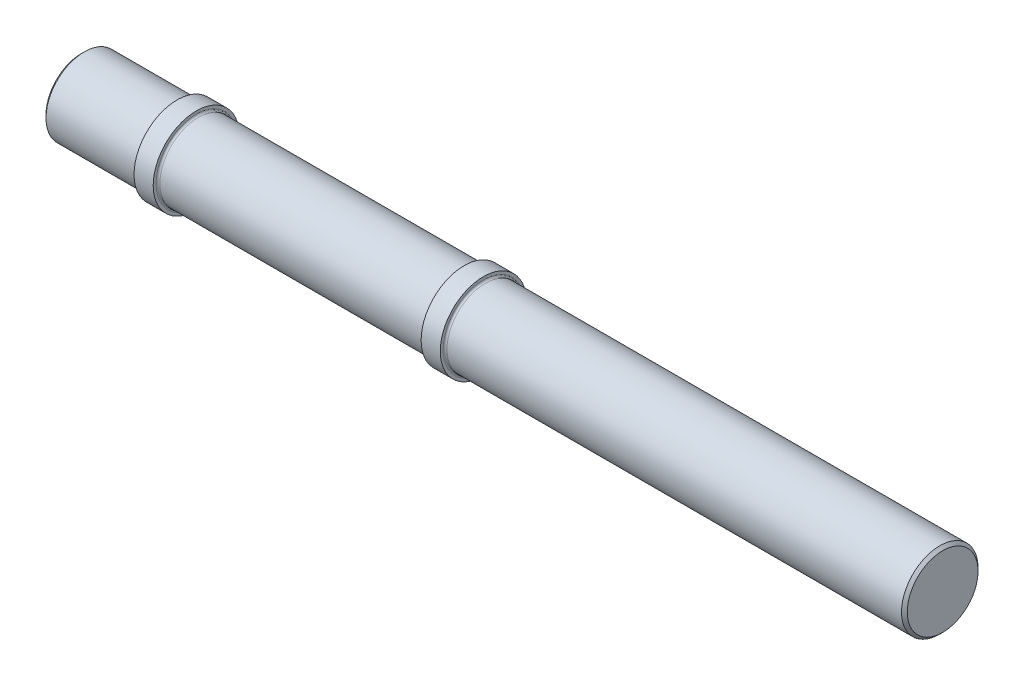
ISO-10303-21;
HEADER;
FILE_DESCRIPTION(('STEP AP214'),'2;1');
FILE_NAME('part.step','',(''),(''),'','','');
FILE_SCHEMA(('AUTOMOTIVE_DESIGN { 1 0 10303 214 1 1 1 1 }'));
ENDSEC;
DATA;
#1=APPLICATION_CONTEXT('core data for automotive mechanical design processes');
#2=APPLICATION_PROTOCOL_DEFINITION('international standard','automotive_design',2000,#1);
#3=PRODUCT_CONTEXT('',#1,'mechanical');
#4=PRODUCT('Part','Part','',(#3));
#5=PRODUCT_RELATED_PRODUCT_CATEGORY('part','',(#4));
#6=PRODUCT_DEFINITION_FORMATION('','',#4);
#7=PRODUCT_DEFINITION_CONTEXT('part definition',#1,'design');
#8=PRODUCT_DEFINITION('design','',#6,#7);
#9=PRODUCT_DEFINITION_SHAPE('','',#8);
#10=(LENGTH_UNIT() NAMED_UNIT(*) SI_UNIT(.MILLI.,.METRE.));
#11=(NAMED_UNIT(*) PLANE_ANGLE_UNIT() SI_UNIT($,.RADIAN.));
#12=(NAMED_UNIT(*) SI_UNIT($,.STERADIAN.) SOLID_ANGLE_UNIT());
#13=UNCERTAINTY_MEASURE_WITH_UNIT(LENGTH_MEASURE(1.E-05),#10,'distance_accuracy_value','');
#14=(GEOMETRIC_REPRESENTATION_CONTEXT(3) GLOBAL_UNCERTAINTY_ASSIGNED_CONTEXT((#13)) GLOBAL_UNIT_ASSIGNED_CONTEXT((#10,
#11,#12)) REPRESENTATION_CONTEXT('',''));
#15=CARTESIAN_POINT('',(0.,0.,0.));
#16=DIRECTION('',(0.,0.,1.));
#17=DIRECTION('',(1.,0.,0.));
#18=AXIS2_PLACEMENT_3D('',#15,#16,#17);
#19=CARTESIAN_POINT('',(0.,0.,0.));
#20=DIRECTION('',(-1.,0.,0.));
#21=DIRECTION('',(0.,0.,1.));
#22=AXIS2_PLACEMENT_3D('',#19,#20,#21);
#23=CYLINDRICAL_SURFACE('',#22,4.);
#24=CARTESIAN_POINT('',(0.299999999999972,0.,0.));
#25=DIRECTION('',(-1.,0.,0.));
#26=DIRECTION('',(0.,0.,1.));
#27=AXIS2_PLACEMENT_3D('',#24,#25,#26);
#28=CIRCLE('',#27,4.);
#29=CARTESIAN_POINT('',(0.299999999999972,0.,4.));
#30=VERTEX_POINT('',#29);
#31=EDGE_CURVE('E10',#30,#30,#28,.F.);
#32=ORIENTED_EDGE('',*,*,#31,.T.);
#33=EDGE_LOOP('',(#32));
#34=FACE_BOUND('',#33,.T.);
#35=CARTESIAN_POINT('',(9.8,0.,0.));
#36=DIRECTION('',(-1.,0.,0.));
#37=DIRECTION('',(0.,0.,1.));
#38=AXIS2_PLACEMENT_3D('',#35,#36,#37);
#39=CIRCLE('',#38,4.);
#40=CARTESIAN_POINT('',(9.8,0.,4.));
#41=VERTEX_POINT('',#40);
#42=EDGE_CURVE('E60',#41,#41,#39,.T.);
#43=ORIENTED_EDGE('',*,*,#42,.T.);
#44=EDGE_LOOP('',(#43));
#45=FACE_BOUND('',#44,.T.);
#46=ADVANCED_FACE('F33',(#34,#45),#23,.T.);
#47=CARTESIAN_POINT('',(0.,0.,0.));
#48=DIRECTION('',(-1.,0.,0.));
#49=DIRECTION('',(0.,0.,1.));
#50=AXIS2_PLACEMENT_3D('',#47,#48,#49);
#51=PLANE('',#50);
#52=CARTESIAN_POINT('',(0.,0.,0.));
#53=DIRECTION('',(-1.,0.,0.));
#54=DIRECTION('',(0.,0.,1.));
#55=AXIS2_PLACEMENT_3D('',#52,#53,#54);
#56=CIRCLE('',#55,3.70000000000002);
#57=CARTESIAN_POINT('',(0.,0.,3.70000000000002));
#58=VERTEX_POINT('',#57);
#59=EDGE_CURVE('E41',#58,#58,#56,.T.);
#60=ORIENTED_EDGE('',*,*,#59,.T.);
#61=EDGE_LOOP('',(#60));
#62=FACE_BOUND('',#61,.T.);
#63=ADVANCED_FACE('F109',(#62),#51,.T.);
#64=CARTESIAN_POINT('',(90.,0.,0.));
#65=DIRECTION('',(-1.,0.,0.));
#66=DIRECTION('',(0.,0.,1.));
#67=AXIS2_PLACEMENT_3D('',#64,#65,#66);
#68=PLANE('',#67);
#69=CARTESIAN_POINT('',(90.,0.,0.));
#70=DIRECTION('',(-1.,0.,0.));
#71=DIRECTION('',(0.,0.,1.));
#72=AXIS2_PLACEMENT_3D('',#69,#70,#71);
#73=CIRCLE('',#72,3.70000000000001);
#74=CARTESIAN_POINT('',(90.,0.,3.70000000000001));
#75=VERTEX_POINT('',#74);
#76=EDGE_CURVE('E45',#75,#75,#73,.F.);
#77=ORIENTED_EDGE('',*,*,#76,.T.);
#78=EDGE_LOOP('',(#77));
#79=FACE_BOUND('',#78,.T.);
#80=ADVANCED_FACE('F114',(#79),#68,.F.);
#81=CARTESIAN_POINT('',(0.,0.,0.));
#82=DIRECTION('',(-1.,0.,0.));
#83=DIRECTION('',(0.,0.,1.));
#84=AXIS2_PLACEMENT_3D('',#81,#82,#83);
#85=CYLINDRICAL_SURFACE('',#84,4.);
#86=CARTESIAN_POINT('',(89.7,0.,0.));
#87=DIRECTION('',(-1.,0.,0.));
#88=DIRECTION('',(0.,0.,1.));
#89=AXIS2_PLACEMENT_3D('',#86,#87,#88);
#90=CIRCLE('',#89,4.);
#91=CARTESIAN_POINT('',(89.7,0.,4.));
#92=VERTEX_POINT('',#91);
#93=EDGE_CURVE('E49',#92,#92,#90,.T.);
#94=ORIENTED_EDGE('',*,*,#93,.T.);
#95=EDGE_LOOP('',(#94));
#96=FACE_BOUND('',#95,.T.);
#97=CARTESIAN_POINT('',(42.2,0.,0.));
#98=DIRECTION('',(1.,0.,0.));
#99=DIRECTION('',(0.,0.,-1.));
#100=AXIS2_PLACEMENT_3D('',#97,#98,#99);
#101=CIRCLE('',#100,4.);
#102=CARTESIAN_POINT('',(42.2,0.,-4.));
#103=VERTEX_POINT('',#102);
#104=EDGE_CURVE('E63',#103,#103,#101,.T.);
#105=ORIENTED_EDGE('',*,*,#104,.T.);
#106=EDGE_LOOP('',(#105));
#107=FACE_BOUND('',#106,.T.);
#108=ADVANCED_FACE('F147',(#96,#107),#85,.T.);
#109=CARTESIAN_POINT('',(42.,0.,0.));
#110=DIRECTION('',(1.,0.,0.));
#111=DIRECTION('',(0.,0.,-1.));
#112=AXIS2_PLACEMENT_3D('',#109,#110,#111);
#113=PLANE('',#112);
#114=CARTESIAN_POINT('',(42.,0.,0.));
#115=DIRECTION('',(1.,0.,0.));
#116=DIRECTION('',(0.,0.,-1.));
#117=AXIS2_PLACEMENT_3D('',#114,#115,#116);
#118=CIRCLE('',#117,4.2);
#119=CARTESIAN_POINT('',(42.,0.,-4.2));
#120=VERTEX_POINT('',#119);
#121=EDGE_CURVE('E66',#120,#120,#118,.F.);
#122=ORIENTED_EDGE('',*,*,#121,.T.);
#123=EDGE_LOOP('',(#122));
#124=FACE_BOUND('',#123,.T.);
#125=CARTESIAN_POINT('',(42.,0.,0.));
#126=DIRECTION('',(-1.,0.,0.));
#127=DIRECTION('',(0.,0.,1.));
#128=AXIS2_PLACEMENT_3D('',#125,#126,#127);
#129=CIRCLE('',#128,4.5);
#130=CARTESIAN_POINT('',(42.,0.,4.5));
#131=VERTEX_POINT('',#130);
#132=EDGE_CURVE('E78',#131,#131,#129,.T.);
#133=ORIENTED_EDGE('',*,*,#132,.F.);
#134=EDGE_LOOP('',(#133));
#135=FACE_BOUND('',#134,.T.);
#136=ADVANCED_FACE('F150',(#124,#135),#113,.T.);
#137=CARTESIAN_POINT('',(0.,0.,0.));
#138=DIRECTION('',(-1.,0.,0.));
#139=DIRECTION('',(0.,0.,1.));
#140=AXIS2_PLACEMENT_3D('',#137,#138,#139);
#141=CYLINDRICAL_SURFACE('',#140,4.5);
#142=ORIENTED_EDGE('',*,*,#132,.T.);
#143=EDGE_LOOP('',(#142));
#144=FACE_BOUND('',#143,.T.);
#145=CARTESIAN_POINT('',(40.,0.,0.));
#146=DIRECTION('',(-1.,0.,0.));
#147=DIRECTION('',(0.,0.,1.));
#148=AXIS2_PLACEMENT_3D('',#145,#146,#147);
#149=CIRCLE('',#148,4.5);
#150=CARTESIAN_POINT('',(40.,0.,4.5));
#151=VERTEX_POINT('',#150);
#152=EDGE_CURVE('E81',#151,#151,#149,.T.);
#153=ORIENTED_EDGE('',*,*,#152,.F.);
#154=EDGE_LOOP('',(#153));
#155=FACE_BOUND('',#154,.T.);
#156=ADVANCED_FACE('F158',(#144,#155),#141,.T.);
#157=CARTESIAN_POINT('',(40.,0.,0.));
#158=DIRECTION('',(-1.,0.,0.));
#159=DIRECTION('',(0.,0.,1.));
#160=AXIS2_PLACEMENT_3D('',#157,#158,#159);
#161=PLANE('',#160);
#162=CARTESIAN_POINT('',(40.,0.,0.));
#163=DIRECTION('',(-1.,0.,0.));
#164=DIRECTION('',(0.,0.,1.));
#165=AXIS2_PLACEMENT_3D('',#162,#163,#164);
#166=CIRCLE('',#165,4.2);
#167=CARTESIAN_POINT('',(40.,0.,4.2));
#168=VERTEX_POINT('',#167);
#169=EDGE_CURVE('E69',#168,#168,#166,.F.);
#170=ORIENTED_EDGE('',*,*,#169,.T.);
#171=EDGE_LOOP('',(#170));
#172=FACE_BOUND('',#171,.T.);
#173=ORIENTED_EDGE('',*,*,#152,.T.);
#174=EDGE_LOOP('',(#173));
#175=FACE_BOUND('',#174,.T.);
#176=ADVANCED_FACE('F164',(#172,#175),#161,.T.);
#177=CARTESIAN_POINT('',(0.,0.,0.));
#178=DIRECTION('',(-1.,0.,0.));
#179=DIRECTION('',(0.,0.,1.));
#180=AXIS2_PLACEMENT_3D('',#177,#178,#179);
#181=CYLINDRICAL_SURFACE('',#180,4.);
#182=CARTESIAN_POINT('',(39.8,0.,0.));
#183=DIRECTION('',(-1.,0.,0.));
#184=DIRECTION('',(0.,0.,1.));
#185=AXIS2_PLACEMENT_3D('',#182,#183,#184);
#186=CIRCLE('',#185,4.);
#187=CARTESIAN_POINT('',(39.8,0.,4.));
#188=VERTEX_POINT('',#187);
#189=EDGE_CURVE('E72',#188,#188,#186,.T.);
#190=ORIENTED_EDGE('',*,*,#189,.T.);
#191=EDGE_LOOP('',(#190));
#192=FACE_BOUND('',#191,.T.);
#193=CARTESIAN_POINT('',(12.2,0.,0.));
#194=DIRECTION('',(1.,0.,0.));
#195=DIRECTION('',(0.,0.,-1.));
#196=AXIS2_PLACEMENT_3D('',#193,#194,#195);
#197=CIRCLE('',#196,4.);
#198=CARTESIAN_POINT('',(12.2,0.,-4.));
#199=VERTEX_POINT('',#198);
#200=EDGE_CURVE('E75',#199,#199,#197,.T.);
#201=ORIENTED_EDGE('',*,*,#200,.T.);
#202=EDGE_LOOP('',(#201));
#203=FACE_BOUND('',#202,.T.);
#204=ADVANCED_FACE('F105',(#192,#203),#181,.T.);
#205=CARTESIAN_POINT('',(12.,0.,0.));
#206=DIRECTION('',(1.,0.,0.));
#207=DIRECTION('',(0.,0.,-1.));
#208=AXIS2_PLACEMENT_3D('',#205,#206,#207);
#209=PLANE('',#208);
#210=CARTESIAN_POINT('',(12.,0.,0.));
#211=DIRECTION('',(1.,0.,0.));
#212=DIRECTION('',(0.,0.,-1.));
#213=AXIS2_PLACEMENT_3D('',#210,#211,#212);
#214=CIRCLE('',#213,4.2);
#215=CARTESIAN_POINT('',(12.,0.,-4.2));
#216=VERTEX_POINT('',#215);
#217=EDGE_CURVE('E54',#216,#216,#214,.F.);
#218=ORIENTED_EDGE('',*,*,#217,.T.);
#219=EDGE_LOOP('',(#218));
#220=FACE_BOUND('',#219,.T.);
#221=CARTESIAN_POINT('',(12.,0.,0.));
#222=DIRECTION('',(-1.,0.,0.));
#223=DIRECTION('',(0.,0.,1.));
#224=AXIS2_PLACEMENT_3D('',#221,#222,#223);
#225=CIRCLE('',#224,4.5);
#226=CARTESIAN_POINT('',(12.,0.,4.5));
#227=VERTEX_POINT('',#226);
#228=EDGE_CURVE('E84',#227,#227,#225,.T.);
#229=ORIENTED_EDGE('',*,*,#228,.F.);
#230=EDGE_LOOP('',(#229));
#231=FACE_BOUND('',#230,.T.);
#232=ADVANCED_FACE('F95',(#220,#231),#209,.T.);
#233=CARTESIAN_POINT('',(0.,0.,0.));
#234=DIRECTION('',(-1.,0.,0.));
#235=DIRECTION('',(0.,0.,1.));
#236=AXIS2_PLACEMENT_3D('',#233,#234,#235);
#237=CYLINDRICAL_SURFACE('',#236,4.5);
#238=ORIENTED_EDGE('',*,*,#228,.T.);
#239=EDGE_LOOP('',(#238));
#240=FACE_BOUND('',#239,.T.);
#241=CARTESIAN_POINT('',(10.,0.,0.));
#242=DIRECTION('',(-1.,0.,0.));
#243=DIRECTION('',(0.,0.,1.));
#244=AXIS2_PLACEMENT_3D('',#241,#242,#243);
#245=CIRCLE('',#244,4.5);
#246=CARTESIAN_POINT('',(10.,0.,4.5));
#247=VERTEX_POINT('',#246);
#248=EDGE_CURVE('E87',#247,#247,#245,.T.);
#249=ORIENTED_EDGE('',*,*,#248,.F.);
#250=EDGE_LOOP('',(#249));
#251=FACE_BOUND('',#250,.T.);
#252=ADVANCED_FACE('F93',(#240,#251),#237,.T.);
#253=CARTESIAN_POINT('',(10.,0.,0.));
#254=DIRECTION('',(-1.,0.,0.));
#255=DIRECTION('',(0.,0.,1.));
#256=AXIS2_PLACEMENT_3D('',#253,#254,#255);
#257=PLANE('',#256);
#258=CARTESIAN_POINT('',(10.,0.,0.));
#259=DIRECTION('',(-1.,0.,0.));
#260=DIRECTION('',(0.,0.,1.));
#261=AXIS2_PLACEMENT_3D('',#258,#259,#260);
#262=CIRCLE('',#261,4.2);
#263=CARTESIAN_POINT('',(10.,0.,4.2));
#264=VERTEX_POINT('',#263);
#265=EDGE_CURVE('E57',#264,#264,#262,.F.);
#266=ORIENTED_EDGE('',*,*,#265,.T.);
#267=EDGE_LOOP('',(#266));
#268=FACE_BOUND('',#267,.T.);
#269=ORIENTED_EDGE('',*,*,#248,.T.);
#270=EDGE_LOOP('',(#269));
#271=FACE_BOUND('',#270,.T.);
#272=ADVANCED_FACE('F91',(#268,#271),#257,.T.);
#273=CARTESIAN_POINT('',(39.8,0.,0.));
#274=DIRECTION('',(-1.,0.,0.));
#275=DIRECTION('',(0.,0.,1.));
#276=AXIS2_PLACEMENT_3D('',#273,#274,#275);
#277=TOROIDAL_SURFACE('',#276,4.2,0.2);
#278=ORIENTED_EDGE('',*,*,#169,.F.);
#279=EDGE_LOOP('',(#278));
#280=FACE_BOUND('',#279,.T.);
#281=ORIENTED_EDGE('',*,*,#189,.F.);
#282=EDGE_LOOP('',(#281));
#283=FACE_BOUND('',#282,.T.);
#284=ADVANCED_FACE('F102',(#280,#283),#277,.F.);
#285=CARTESIAN_POINT('',(42.2,0.,0.));
#286=DIRECTION('',(1.,0.,0.));
#287=DIRECTION('',(0.,0.,-1.));
#288=AXIS2_PLACEMENT_3D('',#285,#286,#287);
#289=TOROIDAL_SURFACE('',#288,4.2,0.2);
#290=ORIENTED_EDGE('',*,*,#104,.F.);
#291=EDGE_LOOP('',(#290));
#292=FACE_BOUND('',#291,.T.);
#293=ORIENTED_EDGE('',*,*,#121,.F.);
#294=EDGE_LOOP('',(#293));
#295=FACE_BOUND('',#294,.T.);
#296=ADVANCED_FACE('F121',(#292,#295),#289,.F.);
#297=CARTESIAN_POINT('',(9.8,0.,0.));
#298=DIRECTION('',(-1.,0.,0.));
#299=DIRECTION('',(0.,0.,1.));
#300=AXIS2_PLACEMENT_3D('',#297,#298,#299);
#301=TOROIDAL_SURFACE('',#300,4.2,0.2);
#302=ORIENTED_EDGE('',*,*,#265,.F.);
#303=EDGE_LOOP('',(#302));
#304=FACE_BOUND('',#303,.T.);
#305=ORIENTED_EDGE('',*,*,#42,.F.);
#306=EDGE_LOOP('',(#305));
#307=FACE_BOUND('',#306,.T.);
#308=ADVANCED_FACE('F125',(#304,#307),#301,.F.);
#309=CARTESIAN_POINT('',(12.2,0.,0.));
#310=DIRECTION('',(1.,0.,0.));
#311=DIRECTION('',(0.,0.,-1.));
#312=AXIS2_PLACEMENT_3D('',#309,#310,#311);
#313=TOROIDAL_SURFACE('',#312,4.2,0.2);
#314=ORIENTED_EDGE('',*,*,#200,.F.);
#315=EDGE_LOOP('',(#314));
#316=FACE_BOUND('',#315,.T.);
#317=ORIENTED_EDGE('',*,*,#217,.F.);
#318=EDGE_LOOP('',(#317));
#319=FACE_BOUND('',#318,.T.);
#320=ADVANCED_FACE('F129',(#316,#319),#313,.F.);
#321=CARTESIAN_POINT('',(89.7,0.,0.));
#322=DIRECTION('',(-1.,0.,0.));
#323=DIRECTION('',(0.,0.,1.));
#324=AXIS2_PLACEMENT_3D('',#321,#322,#323);
#325=CONICAL_SURFACE('',#324,4.,0.785398163397443);
#326=ORIENTED_EDGE('',*,*,#76,.F.);
#327=EDGE_LOOP('',(#326));
#328=FACE_BOUND('',#327,.T.);
#329=ORIENTED_EDGE('',*,*,#93,.F.);
#330=EDGE_LOOP('',(#329));
#331=FACE_BOUND('',#330,.T.);
#332=ADVANCED_FACE('F132',(#328,#331),#325,.T.);
#333=CARTESIAN_POINT('',(0.,0.,0.));
#334=DIRECTION('',(1.,0.,0.));
#335=DIRECTION('',(0.,0.,-1.));
#336=AXIS2_PLACEMENT_3D('',#333,#334,#335);
#337=CONICAL_SURFACE('',#336,3.70000000000002,0.785398163397457);
#338=ORIENTED_EDGE('',*,*,#31,.F.);
#339=EDGE_LOOP('',(#338));
#340=FACE_BOUND('',#339,.T.);
#341=ORIENTED_EDGE('',*,*,#59,.F.);
#342=EDGE_LOOP('',(#341));
#343=FACE_BOUND('',#342,.T.);
#344=ADVANCED_FACE('F36',(#340,#343),#337,.T.);
#345=CLOSED_SHELL('',(#46,#63,#80,#108,#136,#156,#176,#204,#232,#252,#272,#284,#296,#308,#320,
#332,#344));
#346=MANIFOLD_SOLID_BREP('B2',#345);
#347=ADVANCED_BREP_SHAPE_REPRESENTATION('',(#18,#346),#14);
#348=SHAPE_DEFINITION_REPRESENTATION(#9,#347);
ENDSEC;
END-ISO-10303-21;
